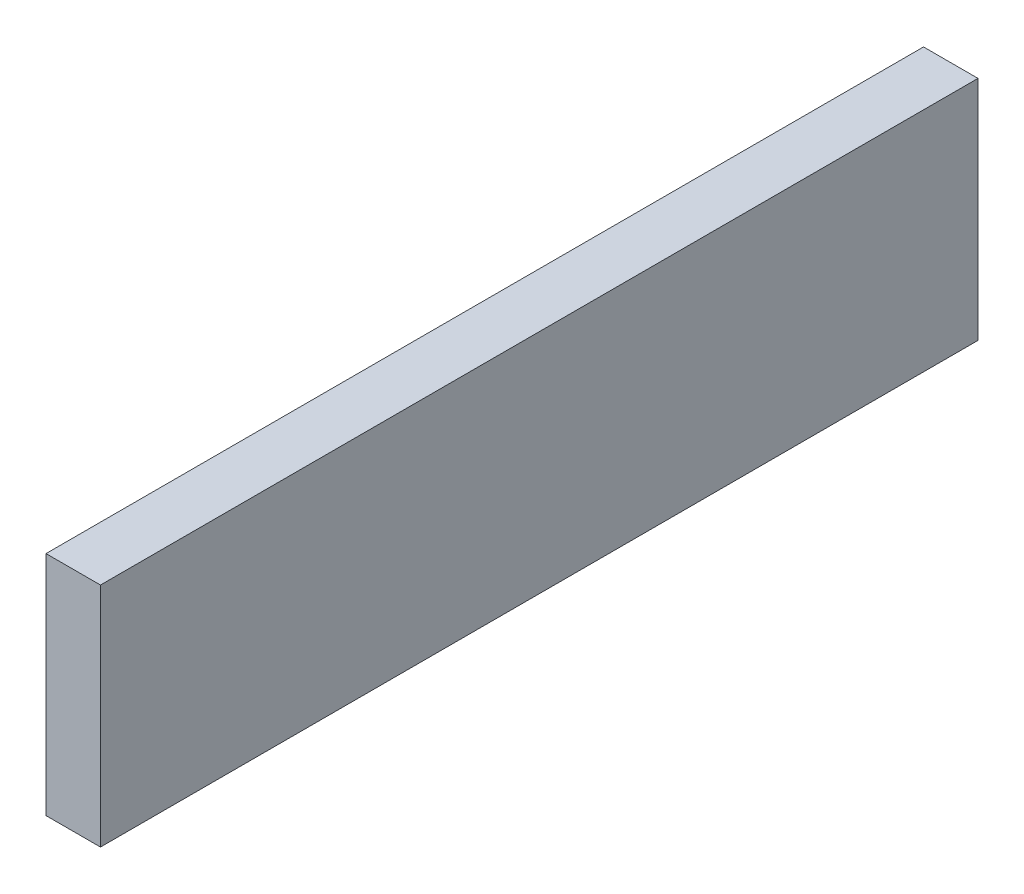
ISO-10303-21;
HEADER;
FILE_DESCRIPTION(('STEP AP214'),'2;1');
FILE_NAME('part.step','',(''),(''),'','','');
FILE_SCHEMA(('AUTOMOTIVE_DESIGN { 1 0 10303 214 1 1 1 1 }'));
ENDSEC;
DATA;
#1=APPLICATION_CONTEXT('core data for automotive mechanical design processes');
#2=APPLICATION_PROTOCOL_DEFINITION('international standard','automotive_design',2000,#1);
#3=PRODUCT_CONTEXT('',#1,'mechanical');
#4=PRODUCT('Part','Part','',(#3));
#5=PRODUCT_RELATED_PRODUCT_CATEGORY('part','',(#4));
#6=PRODUCT_DEFINITION_FORMATION('','',#4);
#7=PRODUCT_DEFINITION_CONTEXT('part definition',#1,'design');
#8=PRODUCT_DEFINITION('design','',#6,#7);
#9=PRODUCT_DEFINITION_SHAPE('','',#8);
#10=(LENGTH_UNIT() NAMED_UNIT(*) SI_UNIT(.MILLI.,.METRE.));
#11=(NAMED_UNIT(*) PLANE_ANGLE_UNIT() SI_UNIT($,.RADIAN.));
#12=(NAMED_UNIT(*) SI_UNIT($,.STERADIAN.) SOLID_ANGLE_UNIT());
#13=UNCERTAINTY_MEASURE_WITH_UNIT(LENGTH_MEASURE(1.E-05),#10,'distance_accuracy_value','');
#14=(GEOMETRIC_REPRESENTATION_CONTEXT(3) GLOBAL_UNCERTAINTY_ASSIGNED_CONTEXT((#13)) GLOBAL_UNIT_ASSIGNED_CONTEXT((#10,
#11,#12)) REPRESENTATION_CONTEXT('',''));
#15=CARTESIAN_POINT('',(0.,0.,0.));
#16=DIRECTION('',(0.,0.,1.));
#17=DIRECTION('',(1.,0.,0.));
#18=AXIS2_PLACEMENT_3D('',#15,#16,#17);
#19=CARTESIAN_POINT('',(9.,-37.5,-145.));
#20=DIRECTION('',(0.,0.,1.));
#21=DIRECTION('',(1.,0.,0.));
#22=AXIS2_PLACEMENT_3D('',#19,#20,#21);
#23=PLANE('',#22);
#24=DIRECTION('',(0.,1.,0.));
#25=VECTOR('',#24,1.);
#26=CARTESIAN_POINT('',(-9.,-37.5,-145.));
#27=LINE('',#26,#25);
#28=CARTESIAN_POINT('',(-9.,-37.5,-145.));
#29=VERTEX_POINT('',#28);
#30=CARTESIAN_POINT('',(-9.,37.5,-145.));
#31=VERTEX_POINT('',#30);
#32=EDGE_CURVE('E102',#29,#31,#27,.T.);
#33=ORIENTED_EDGE('',*,*,#32,.T.);
#34=DIRECTION('',(-1.,0.,0.));
#35=VECTOR('',#34,1.);
#36=CARTESIAN_POINT('',(9.,37.5,-145.));
#37=LINE('',#36,#35);
#38=CARTESIAN_POINT('',(9.,37.5,-145.));
#39=VERTEX_POINT('',#38);
#40=EDGE_CURVE('E11',#39,#31,#37,.T.);
#41=ORIENTED_EDGE('',*,*,#40,.F.);
#42=DIRECTION('',(0.,1.,0.));
#43=VECTOR('',#42,1.);
#44=CARTESIAN_POINT('',(9.,-37.5,-145.));
#45=LINE('',#44,#43);
#46=CARTESIAN_POINT('',(9.,-37.5,-145.));
#47=VERTEX_POINT('',#46);
#48=EDGE_CURVE('E90',#47,#39,#45,.T.);
#49=ORIENTED_EDGE('',*,*,#48,.F.);
#50=DIRECTION('',(-1.,0.,0.));
#51=VECTOR('',#50,1.);
#52=CARTESIAN_POINT('',(9.,-37.5,-145.));
#53=LINE('',#52,#51);
#54=EDGE_CURVE('E98',#47,#29,#53,.T.);
#55=ORIENTED_EDGE('',*,*,#54,.T.);
#56=EDGE_LOOP('',(#33,#41,#49,#55));
#57=FACE_BOUND('',#56,.T.);
#58=ADVANCED_FACE('F39',(#57),#23,.F.);
#59=CARTESIAN_POINT('',(9.,37.5,145.));
#60=DIRECTION('',(0.,-1.,0.));
#61=DIRECTION('',(0.,0.,-1.));
#62=AXIS2_PLACEMENT_3D('',#59,#60,#61);
#63=PLANE('',#62);
#64=DIRECTION('',(0.,0.,1.));
#65=VECTOR('',#64,1.);
#66=CARTESIAN_POINT('',(-9.,37.5,145.));
#67=LINE('',#66,#65);
#68=CARTESIAN_POINT('',(-9.,37.5,145.));
#69=VERTEX_POINT('',#68);
#70=EDGE_CURVE('E94',#31,#69,#67,.T.);
#71=ORIENTED_EDGE('',*,*,#70,.T.);
#72=DIRECTION('',(-1.,0.,0.));
#73=VECTOR('',#72,1.);
#74=CARTESIAN_POINT('',(9.,37.5,145.));
#75=LINE('',#74,#73);
#76=CARTESIAN_POINT('',(9.,37.5,145.));
#77=VERTEX_POINT('',#76);
#78=EDGE_CURVE('E47',#77,#69,#75,.T.);
#79=ORIENTED_EDGE('',*,*,#78,.F.);
#80=DIRECTION('',(0.,0.,1.));
#81=VECTOR('',#80,1.);
#82=CARTESIAN_POINT('',(9.,37.5,145.));
#83=LINE('',#82,#81);
#84=EDGE_CURVE('E85',#39,#77,#83,.T.);
#85=ORIENTED_EDGE('',*,*,#84,.F.);
#86=ORIENTED_EDGE('',*,*,#40,.T.);
#87=EDGE_LOOP('',(#71,#79,#85,#86));
#88=FACE_BOUND('',#87,.T.);
#89=ADVANCED_FACE('F93',(#88),#63,.F.);
#90=CARTESIAN_POINT('',(9.,-37.5,145.));
#91=DIRECTION('',(0.,0.,-1.));
#92=DIRECTION('',(-1.,0.,0.));
#93=AXIS2_PLACEMENT_3D('',#90,#91,#92);
#94=PLANE('',#93);
#95=DIRECTION('',(0.,-1.,0.));
#96=VECTOR('',#95,1.);
#97=CARTESIAN_POINT('',(-9.,-37.5,145.));
#98=LINE('',#97,#96);
#99=CARTESIAN_POINT('',(-9.,-37.5,145.));
#100=VERTEX_POINT('',#99);
#101=EDGE_CURVE('E72',#69,#100,#98,.T.);
#102=ORIENTED_EDGE('',*,*,#101,.T.);
#103=DIRECTION('',(-1.,0.,0.));
#104=VECTOR('',#103,1.);
#105=CARTESIAN_POINT('',(9.,-37.5,145.));
#106=LINE('',#105,#104);
#107=CARTESIAN_POINT('',(9.,-37.5,145.));
#108=VERTEX_POINT('',#107);
#109=EDGE_CURVE('E95',#108,#100,#106,.T.);
#110=ORIENTED_EDGE('',*,*,#109,.F.);
#111=DIRECTION('',(0.,-1.,0.));
#112=VECTOR('',#111,1.);
#113=CARTESIAN_POINT('',(9.,-37.5,145.));
#114=LINE('',#113,#112);
#115=EDGE_CURVE('E88',#77,#108,#114,.T.);
#116=ORIENTED_EDGE('',*,*,#115,.F.);
#117=ORIENTED_EDGE('',*,*,#78,.T.);
#118=EDGE_LOOP('',(#102,#110,#116,#117));
#119=FACE_BOUND('',#118,.T.);
#120=ADVANCED_FACE('F96',(#119),#94,.F.);
#121=CARTESIAN_POINT('',(9.,-37.5,145.));
#122=DIRECTION('',(0.,1.,0.));
#123=DIRECTION('',(0.,0.,1.));
#124=AXIS2_PLACEMENT_3D('',#121,#122,#123);
#125=PLANE('',#124);
#126=DIRECTION('',(0.,0.,-1.));
#127=VECTOR('',#126,1.);
#128=CARTESIAN_POINT('',(-9.,-37.5,145.));
#129=LINE('',#128,#127);
#130=EDGE_CURVE('E78',#100,#29,#129,.T.);
#131=ORIENTED_EDGE('',*,*,#130,.T.);
#132=ORIENTED_EDGE('',*,*,#54,.F.);
#133=DIRECTION('',(0.,0.,-1.));
#134=VECTOR('',#133,1.);
#135=CARTESIAN_POINT('',(9.,-37.5,145.));
#136=LINE('',#135,#134);
#137=EDGE_CURVE('E55',#108,#47,#136,.T.);
#138=ORIENTED_EDGE('',*,*,#137,.F.);
#139=ORIENTED_EDGE('',*,*,#109,.T.);
#140=EDGE_LOOP('',(#131,#132,#138,#139));
#141=FACE_BOUND('',#140,.T.);
#142=ADVANCED_FACE('F109',(#141),#125,.F.);
#143=CARTESIAN_POINT('',(9.,0.,0.));
#144=DIRECTION('',(-1.,0.,0.));
#145=DIRECTION('',(0.,0.,1.));
#146=AXIS2_PLACEMENT_3D('',#143,#144,#145);
#147=PLANE('',#146);
#148=ORIENTED_EDGE('',*,*,#48,.T.);
#149=ORIENTED_EDGE('',*,*,#84,.T.);
#150=ORIENTED_EDGE('',*,*,#115,.T.);
#151=ORIENTED_EDGE('',*,*,#137,.T.);
#152=EDGE_LOOP('',(#148,#149,#150,#151));
#153=FACE_BOUND('',#152,.T.);
#154=ADVANCED_FACE('F86',(#153),#147,.F.);
#155=CARTESIAN_POINT('',(-9.,0.,0.));
#156=DIRECTION('',(-1.,0.,0.));
#157=DIRECTION('',(0.,0.,1.));
#158=AXIS2_PLACEMENT_3D('',#155,#156,#157);
#159=PLANE('',#158);
#160=ORIENTED_EDGE('',*,*,#32,.F.);
#161=ORIENTED_EDGE('',*,*,#130,.F.);
#162=ORIENTED_EDGE('',*,*,#101,.F.);
#163=ORIENTED_EDGE('',*,*,#70,.F.);
#164=EDGE_LOOP('',(#160,#161,#162,#163));
#165=FACE_BOUND('',#164,.T.);
#166=ADVANCED_FACE('F112',(#165),#159,.T.);
#167=CLOSED_SHELL('',(#58,#89,#120,#142,#154,#166));
#168=MANIFOLD_SOLID_BREP('B2',#167);
#169=ADVANCED_BREP_SHAPE_REPRESENTATION('',(#18,#168),#14);
#170=SHAPE_DEFINITION_REPRESENTATION(#9,#169);
ENDSEC;
END-ISO-10303-21;
